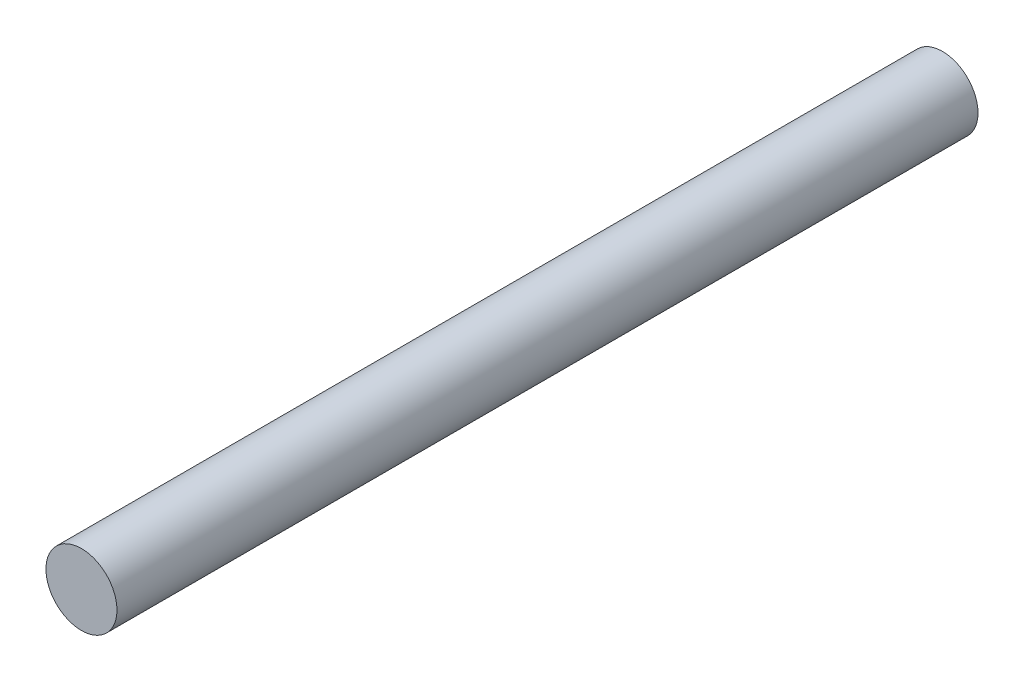
ISO-10303-21;
HEADER;
FILE_DESCRIPTION(('STEP AP214'),'2;1');
FILE_NAME('part.step','',(''),(''),'','','');
FILE_SCHEMA(('AUTOMOTIVE_DESIGN { 1 0 10303 214 1 1 1 1 }'));
ENDSEC;
DATA;
#1=APPLICATION_CONTEXT('core data for automotive mechanical design processes');
#2=APPLICATION_PROTOCOL_DEFINITION('international standard','automotive_design',2000,#1);
#3=PRODUCT_CONTEXT('',#1,'mechanical');
#4=PRODUCT('Part','Part','',(#3));
#5=PRODUCT_RELATED_PRODUCT_CATEGORY('part','',(#4));
#6=PRODUCT_DEFINITION_FORMATION('','',#4);
#7=PRODUCT_DEFINITION_CONTEXT('part definition',#1,'design');
#8=PRODUCT_DEFINITION('design','',#6,#7);
#9=PRODUCT_DEFINITION_SHAPE('','',#8);
#10=(LENGTH_UNIT() NAMED_UNIT(*) SI_UNIT(.MILLI.,.METRE.));
#11=(NAMED_UNIT(*) PLANE_ANGLE_UNIT() SI_UNIT($,.RADIAN.));
#12=(NAMED_UNIT(*) SI_UNIT($,.STERADIAN.) SOLID_ANGLE_UNIT());
#13=UNCERTAINTY_MEASURE_WITH_UNIT(LENGTH_MEASURE(1.E-05),#10,'distance_accuracy_value','');
#14=(GEOMETRIC_REPRESENTATION_CONTEXT(3) GLOBAL_UNCERTAINTY_ASSIGNED_CONTEXT((#13)) GLOBAL_UNIT_ASSIGNED_CONTEXT((#10,
#11,#12)) REPRESENTATION_CONTEXT('',''));
#15=CARTESIAN_POINT('',(0.,0.,0.));
#16=DIRECTION('',(0.,0.,1.));
#17=DIRECTION('',(1.,0.,0.));
#18=AXIS2_PLACEMENT_3D('',#15,#16,#17);
#19=CARTESIAN_POINT('',(0.,0.,101.6));
#20=DIRECTION('',(0.,0.,-1.));
#21=DIRECTION('',(-1.,0.,0.));
#22=AXIS2_PLACEMENT_3D('',#19,#20,#21);
#23=CYLINDRICAL_SURFACE('',#22,4.191);
#24=CARTESIAN_POINT('',(0.,0.,101.6));
#25=DIRECTION('',(0.,0.,1.));
#26=DIRECTION('',(1.,0.,0.));
#27=AXIS2_PLACEMENT_3D('',#24,#25,#26);
#28=CIRCLE('',#27,4.191);
#29=CARTESIAN_POINT('',(4.191,0.,101.6));
#30=VERTEX_POINT('',#29);
#31=EDGE_CURVE('E10',#30,#30,#28,.T.);
#32=ORIENTED_EDGE('',*,*,#31,.F.);
#33=EDGE_LOOP('',(#32));
#34=FACE_BOUND('',#33,.T.);
#35=CARTESIAN_POINT('',(0.,0.,0.));
#36=DIRECTION('',(0.,0.,1.));
#37=DIRECTION('',(1.,0.,0.));
#38=AXIS2_PLACEMENT_3D('',#35,#36,#37);
#39=CIRCLE('',#38,4.191);
#40=CARTESIAN_POINT('',(4.191,0.,0.));
#41=VERTEX_POINT('',#40);
#42=EDGE_CURVE('E33',#41,#41,#39,.T.);
#43=ORIENTED_EDGE('',*,*,#42,.T.);
#44=EDGE_LOOP('',(#43));
#45=FACE_BOUND('',#44,.T.);
#46=ADVANCED_FACE('F27',(#34,#45),#23,.T.);
#47=CARTESIAN_POINT('',(0.,0.,101.6));
#48=DIRECTION('',(0.,0.,1.));
#49=DIRECTION('',(1.,0.,0.));
#50=AXIS2_PLACEMENT_3D('',#47,#48,#49);
#51=PLANE('',#50);
#52=ORIENTED_EDGE('',*,*,#31,.T.);
#53=EDGE_LOOP('',(#52));
#54=FACE_BOUND('',#53,.T.);
#55=ADVANCED_FACE('F42',(#54),#51,.T.);
#56=CARTESIAN_POINT('',(0.,0.,0.));
#57=DIRECTION('',(0.,0.,1.));
#58=DIRECTION('',(1.,0.,0.));
#59=AXIS2_PLACEMENT_3D('',#56,#57,#58);
#60=PLANE('',#59);
#61=ORIENTED_EDGE('',*,*,#42,.F.);
#62=EDGE_LOOP('',(#61));
#63=FACE_BOUND('',#62,.T.);
#64=ADVANCED_FACE('F40',(#63),#60,.F.);
#65=CLOSED_SHELL('',(#46,#55,#64));
#66=MANIFOLD_SOLID_BREP('B2',#65);
#67=ADVANCED_BREP_SHAPE_REPRESENTATION('',(#18,#66),#14);
#68=SHAPE_DEFINITION_REPRESENTATION(#9,#67);
ENDSEC;
END-ISO-10303-21;
